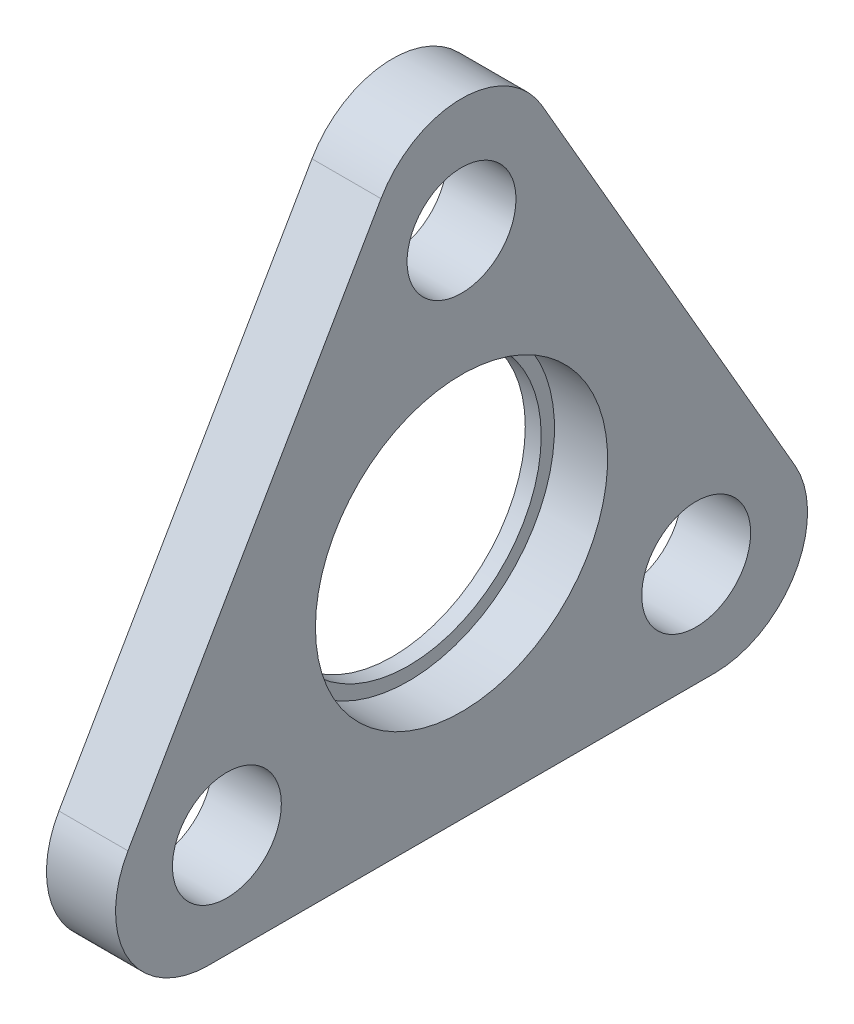
ISO-10303-21;
HEADER;
FILE_DESCRIPTION(('STEP AP214'),'2;1');
FILE_NAME('part.step','',(''),(''),'','','');
FILE_SCHEMA(('AUTOMOTIVE_DESIGN { 1 0 10303 214 1 1 1 1 }'));
ENDSEC;
DATA;
#1=APPLICATION_CONTEXT('core data for automotive mechanical design processes');
#2=APPLICATION_PROTOCOL_DEFINITION('international standard','automotive_design',2000,#1);
#3=PRODUCT_CONTEXT('',#1,'mechanical');
#4=PRODUCT('Part','Part','',(#3));
#5=PRODUCT_RELATED_PRODUCT_CATEGORY('part','',(#4));
#6=PRODUCT_DEFINITION_FORMATION('','',#4);
#7=PRODUCT_DEFINITION_CONTEXT('part definition',#1,'design');
#8=PRODUCT_DEFINITION('design','',#6,#7);
#9=PRODUCT_DEFINITION_SHAPE('','',#8);
#10=(LENGTH_UNIT() NAMED_UNIT(*) SI_UNIT(.MILLI.,.METRE.));
#11=(NAMED_UNIT(*) PLANE_ANGLE_UNIT() SI_UNIT($,.RADIAN.));
#12=(NAMED_UNIT(*) SI_UNIT($,.STERADIAN.) SOLID_ANGLE_UNIT());
#13=UNCERTAINTY_MEASURE_WITH_UNIT(LENGTH_MEASURE(1.E-05),#10,'distance_accuracy_value','');
#14=(GEOMETRIC_REPRESENTATION_CONTEXT(3) GLOBAL_UNCERTAINTY_ASSIGNED_CONTEXT((#13)) GLOBAL_UNIT_ASSIGNED_CONTEXT((#10,
#11,#12)) REPRESENTATION_CONTEXT('',''));
#15=CARTESIAN_POINT('',(0.,0.,0.));
#16=DIRECTION('',(0.,0.,1.));
#17=DIRECTION('',(1.,0.,0.));
#18=AXIS2_PLACEMENT_3D('',#15,#16,#17);
#19=CARTESIAN_POINT('',(0.6,0.,0.));
#20=DIRECTION('',(-1.,0.,0.));
#21=DIRECTION('',(0.,0.,1.));
#22=AXIS2_PLACEMENT_3D('',#19,#20,#21);
#23=CYLINDRICAL_SURFACE('',#22,5.5);
#24=CARTESIAN_POINT('',(0.6,0.,0.));
#25=DIRECTION('',(-1.,0.,0.));
#26=DIRECTION('',(0.,0.,1.));
#27=AXIS2_PLACEMENT_3D('',#24,#25,#26);
#28=CIRCLE('',#27,5.5);
#29=CARTESIAN_POINT('',(0.6,0.,5.5));
#30=VERTEX_POINT('',#29);
#31=EDGE_CURVE('E11',#30,#30,#28,.T.);
#32=ORIENTED_EDGE('',*,*,#31,.T.);
#33=EDGE_LOOP('',(#32));
#34=FACE_BOUND('',#33,.T.);
#35=CARTESIAN_POINT('',(0.,0.,0.));
#36=DIRECTION('',(-1.,0.,0.));
#37=DIRECTION('',(0.,0.,1.));
#38=AXIS2_PLACEMENT_3D('',#35,#36,#37);
#39=CIRCLE('',#38,5.5);
#40=CARTESIAN_POINT('',(0.,0.,5.5));
#41=VERTEX_POINT('',#40);
#42=EDGE_CURVE('E54',#41,#41,#39,.T.);
#43=ORIENTED_EDGE('',*,*,#42,.F.);
#44=EDGE_LOOP('',(#43));
#45=FACE_BOUND('',#44,.T.);
#46=ADVANCED_FACE('F51',(#34,#45),#23,.T.);
#47=CARTESIAN_POINT('',(0.6,0.,0.));
#48=DIRECTION('',(-1.,0.,0.));
#49=DIRECTION('',(0.,0.,1.));
#50=AXIS2_PLACEMENT_3D('',#47,#48,#49);
#51=PLANE('',#50);
#52=CARTESIAN_POINT('',(0.6,0.,0.));
#53=DIRECTION('',(-1.,0.,0.));
#54=DIRECTION('',(0.,0.,1.));
#55=AXIS2_PLACEMENT_3D('',#52,#53,#54);
#56=CIRCLE('',#55,5.);
#57=CARTESIAN_POINT('',(0.6,0.,5.));
#58=VERTEX_POINT('',#57);
#59=EDGE_CURVE('E61',#58,#58,#56,.T.);
#60=ORIENTED_EDGE('',*,*,#59,.T.);
#61=EDGE_LOOP('',(#60));
#62=FACE_BOUND('',#61,.T.);
#63=ORIENTED_EDGE('',*,*,#31,.F.);
#64=EDGE_LOOP('',(#63));
#65=FACE_BOUND('',#64,.T.);
#66=ADVANCED_FACE('F69',(#62,#65),#51,.F.);
#67=CARTESIAN_POINT('',(0.,0.,0.));
#68=DIRECTION('',(-1.,0.,0.));
#69=DIRECTION('',(0.,0.,1.));
#70=AXIS2_PLACEMENT_3D('',#67,#68,#69);
#71=PLANE('',#70);
#72=CARTESIAN_POINT('',(0.,0.,0.));
#73=DIRECTION('',(-1.,0.,0.));
#74=DIRECTION('',(0.,0.,1.));
#75=AXIS2_PLACEMENT_3D('',#72,#73,#74);
#76=CIRCLE('',#75,5.);
#77=CARTESIAN_POINT('',(0.,0.,5.));
#78=VERTEX_POINT('',#77);
#79=EDGE_CURVE('E63',#78,#78,#76,.T.);
#80=ORIENTED_EDGE('',*,*,#79,.F.);
#81=EDGE_LOOP('',(#80));
#82=FACE_BOUND('',#81,.T.);
#83=ORIENTED_EDGE('',*,*,#42,.T.);
#84=EDGE_LOOP('',(#83));
#85=FACE_BOUND('',#84,.T.);
#86=ADVANCED_FACE('F75',(#82,#85),#71,.T.);
#87=CARTESIAN_POINT('',(0.6,0.,0.));
#88=DIRECTION('',(-1.,0.,0.));
#89=DIRECTION('',(0.,0.,1.));
#90=AXIS2_PLACEMENT_3D('',#87,#88,#89);
#91=CYLINDRICAL_SURFACE('',#90,5.);
#92=ORIENTED_EDGE('',*,*,#59,.F.);
#93=EDGE_LOOP('',(#92));
#94=FACE_BOUND('',#93,.T.);
#95=ORIENTED_EDGE('',*,*,#79,.T.);
#96=EDGE_LOOP('',(#95));
#97=FACE_BOUND('',#96,.T.);
#98=ADVANCED_FACE('F72',(#94,#97),#91,.F.);
#99=CLOSED_SHELL('',(#46,#66,#86,#98));
#100=MANIFOLD_SOLID_BREP('B2',#99);
#101=CARTESIAN_POINT('',(2.6,4.49999999999996,7.79422863405993));
#102=DIRECTION('',(0.,-0.499999999999998,-0.86602540378444));
#103=DIRECTION('',(0.,0.86602540378444,-0.499999999999998));
#104=AXIS2_PLACEMENT_3D('',#101,#102,#103);
#105=PLANE('',#104);
#106=DIRECTION('',(0.,-0.86602540378444,0.499999999999998));
#107=VECTOR('',#106,1.);
#108=CARTESIAN_POINT('',(0.,4.49999999999996,7.79422863405993));
#109=LINE('',#108,#107);
#110=CARTESIAN_POINT('',(0.,12.75,3.03108891324554));
#111=VERTEX_POINT('',#110);
#112=CARTESIAN_POINT('',(0.,-3.75000000000009,12.5573683548743));
#113=VERTEX_POINT('',#112);
#114=EDGE_CURVE('E198',#111,#113,#109,.T.);
#115=ORIENTED_EDGE('',*,*,#114,.T.);
#116=DIRECTION('',(-1.,0.,0.));
#117=VECTOR('',#116,1.);
#118=CARTESIAN_POINT('',(2.6,-3.75000000000008,12.5573683548743));
#119=LINE('',#118,#117);
#120=CARTESIAN_POINT('',(2.6,-3.75000000000009,12.5573683548743));
#121=VERTEX_POINT('',#120);
#122=EDGE_CURVE('E173',#113,#121,#119,.F.);
#123=ORIENTED_EDGE('',*,*,#122,.T.);
#124=DIRECTION('',(0.,-0.86602540378444,0.499999999999998));
#125=VECTOR('',#124,1.);
#126=CARTESIAN_POINT('',(2.6,4.49999999999996,7.79422863405993));
#127=LINE('',#126,#125);
#128=CARTESIAN_POINT('',(2.6,12.75,3.03108891324554));
#129=VERTEX_POINT('',#128);
#130=EDGE_CURVE('E219',#129,#121,#127,.T.);
#131=ORIENTED_EDGE('',*,*,#130,.F.);
#132=DIRECTION('',(-1.,0.,0.));
#133=VECTOR('',#132,1.);
#134=CARTESIAN_POINT('',(2.6,12.75,3.03108891324554));
#135=LINE('',#134,#133);
#136=EDGE_CURVE('E179',#129,#111,#135,.T.);
#137=ORIENTED_EDGE('',*,*,#136,.T.);
#138=EDGE_LOOP('',(#115,#123,#131,#137));
#139=FACE_BOUND('',#138,.T.);
#140=ADVANCED_FACE('F113',(#139),#105,.F.);
#141=CARTESIAN_POINT('',(2.6,-9.00000000000008,0.));
#142=DIRECTION('',(0.,1.,0.));
#143=DIRECTION('',(0.,0.,1.));
#144=AXIS2_PLACEMENT_3D('',#141,#142,#143);
#145=PLANE('',#144);
#146=DIRECTION('',(0.,0.,-1.));
#147=VECTOR('',#146,1.);
#148=CARTESIAN_POINT('',(2.6,-9.00000000000008,0.));
#149=LINE('',#148,#147);
#150=CARTESIAN_POINT('',(2.6,-9.00000000000008,9.5262794416288));
#151=VERTEX_POINT('',#150);
#152=CARTESIAN_POINT('',(2.6,-9.00000000000008,-9.5262794416288));
#153=VERTEX_POINT('',#152);
#154=EDGE_CURVE('E188',#151,#153,#149,.T.);
#155=ORIENTED_EDGE('',*,*,#154,.F.);
#156=DIRECTION('',(-1.,0.,0.));
#157=VECTOR('',#156,1.);
#158=CARTESIAN_POINT('',(2.6,-9.00000000000008,9.5262794416288));
#159=LINE('',#158,#157);
#160=CARTESIAN_POINT('',(0.,-9.00000000000008,9.5262794416288));
#161=VERTEX_POINT('',#160);
#162=EDGE_CURVE('E172',#151,#161,#159,.T.);
#163=ORIENTED_EDGE('',*,*,#162,.T.);
#164=DIRECTION('',(0.,0.,-1.));
#165=VECTOR('',#164,1.);
#166=CARTESIAN_POINT('',(0.,-9.00000000000008,0.));
#167=LINE('',#166,#165);
#168=CARTESIAN_POINT('',(0.,-9.00000000000008,-9.5262794416288));
#169=VERTEX_POINT('',#168);
#170=EDGE_CURVE('E186',#161,#169,#167,.T.);
#171=ORIENTED_EDGE('',*,*,#170,.T.);
#172=DIRECTION('',(-1.,0.,0.));
#173=VECTOR('',#172,1.);
#174=CARTESIAN_POINT('',(2.6,-9.00000000000008,-9.5262794416288));
#175=LINE('',#174,#173);
#176=EDGE_CURVE('E191',#169,#153,#175,.F.);
#177=ORIENTED_EDGE('',*,*,#176,.T.);
#178=EDGE_LOOP('',(#155,#163,#171,#177));
#179=FACE_BOUND('',#178,.T.);
#180=ADVANCED_FACE('F185',(#179),#145,.F.);
#181=CARTESIAN_POINT('',(2.6,-5.09999999999962,-8.83345911860193));
#182=DIRECTION('',(-1.,0.,0.));
#183=DIRECTION('',(0.,0.,1.));
#184=AXIS2_PLACEMENT_3D('',#181,#182,#183);
#185=CYLINDRICAL_SURFACE('',#184,2.05);
#186=CARTESIAN_POINT('',(2.6,-5.09999999999962,-8.83345911860193));
#187=DIRECTION('',(1.,0.,0.));
#188=DIRECTION('',(0.,0.,-1.));
#189=AXIS2_PLACEMENT_3D('',#186,#187,#188);
#190=CIRCLE('',#189,2.05);
#191=CARTESIAN_POINT('',(2.6,-5.09999999999962,-10.8834591186019));
#192=VERTEX_POINT('',#191);
#193=EDGE_CURVE('E243',#192,#192,#190,.T.);
#194=ORIENTED_EDGE('',*,*,#193,.T.);
#195=EDGE_LOOP('',(#194));
#196=FACE_BOUND('',#195,.T.);
#197=CARTESIAN_POINT('',(0.,-5.09999999999962,-8.83345911860193));
#198=DIRECTION('',(1.,0.,0.));
#199=DIRECTION('',(0.,0.,-1.));
#200=AXIS2_PLACEMENT_3D('',#197,#198,#199);
#201=CIRCLE('',#200,2.05);
#202=CARTESIAN_POINT('',(0.,-5.09999999999962,-10.8834591186019));
#203=VERTEX_POINT('',#202);
#204=EDGE_CURVE('E211',#203,#203,#201,.T.);
#205=ORIENTED_EDGE('',*,*,#204,.F.);
#206=EDGE_LOOP('',(#205));
#207=FACE_BOUND('',#206,.T.);
#208=ADVANCED_FACE('F293',(#196,#207),#185,.F.);
#209=CARTESIAN_POINT('',(2.6,-5.10000000000038,8.83345911860062));
#210=DIRECTION('',(-1.,0.,0.));
#211=DIRECTION('',(0.,0.,1.));
#212=AXIS2_PLACEMENT_3D('',#209,#210,#211);
#213=CYLINDRICAL_SURFACE('',#212,2.05);
#214=CARTESIAN_POINT('',(2.6,-5.10000000000038,8.83345911860062));
#215=DIRECTION('',(1.,0.,0.));
#216=DIRECTION('',(0.,0.,-1.));
#217=AXIS2_PLACEMENT_3D('',#214,#215,#216);
#218=CIRCLE('',#217,2.05);
#219=CARTESIAN_POINT('',(2.6,-5.10000000000038,6.78345911860062));
#220=VERTEX_POINT('',#219);
#221=EDGE_CURVE('E246',#220,#220,#218,.T.);
#222=ORIENTED_EDGE('',*,*,#221,.T.);
#223=EDGE_LOOP('',(#222));
#224=FACE_BOUND('',#223,.T.);
#225=CARTESIAN_POINT('',(0.,-5.10000000000038,8.83345911860062));
#226=DIRECTION('',(1.,0.,0.));
#227=DIRECTION('',(0.,0.,-1.));
#228=AXIS2_PLACEMENT_3D('',#225,#226,#227);
#229=CIRCLE('',#228,2.05);
#230=CARTESIAN_POINT('',(0.,-5.10000000000038,6.78345911860062));
#231=VERTEX_POINT('',#230);
#232=EDGE_CURVE('E202',#231,#231,#229,.T.);
#233=ORIENTED_EDGE('',*,*,#232,.F.);
#234=EDGE_LOOP('',(#233));
#235=FACE_BOUND('',#234,.T.);
#236=ADVANCED_FACE('F320',(#224,#235),#213,.F.);
#237=CARTESIAN_POINT('',(2.6,4.49999999999996,-7.79422863405993));
#238=DIRECTION('',(0.,-0.499999999999998,0.86602540378444));
#239=DIRECTION('',(0.,-0.86602540378444,-0.499999999999998));
#240=AXIS2_PLACEMENT_3D('',#237,#238,#239);
#241=PLANE('',#240);
#242=DIRECTION('',(0.,0.86602540378444,0.499999999999998));
#243=VECTOR('',#242,1.);
#244=CARTESIAN_POINT('',(2.6,4.49999999999996,-7.79422863405993));
#245=LINE('',#244,#243);
#246=CARTESIAN_POINT('',(2.6,-3.75000000000008,-12.5573683548743));
#247=VERTEX_POINT('',#246);
#248=CARTESIAN_POINT('',(2.6,12.75,-3.03108891324554));
#249=VERTEX_POINT('',#248);
#250=EDGE_CURVE('E250',#247,#249,#245,.T.);
#251=ORIENTED_EDGE('',*,*,#250,.F.);
#252=DIRECTION('',(-1.,0.,0.));
#253=VECTOR('',#252,1.);
#254=CARTESIAN_POINT('',(2.6,-3.75000000000008,-12.5573683548743));
#255=LINE('',#254,#253);
#256=CARTESIAN_POINT('',(0.,-3.75000000000008,-12.5573683548743));
#257=VERTEX_POINT('',#256);
#258=EDGE_CURVE('E49',#247,#257,#255,.T.);
#259=ORIENTED_EDGE('',*,*,#258,.T.);
#260=DIRECTION('',(0.,0.86602540378444,0.499999999999998));
#261=VECTOR('',#260,1.);
#262=CARTESIAN_POINT('',(0.,4.49999999999996,-7.79422863405993));
#263=LINE('',#262,#261);
#264=CARTESIAN_POINT('',(0.,12.75,-3.03108891324554));
#265=VERTEX_POINT('',#264);
#266=EDGE_CURVE('E197',#257,#265,#263,.T.);
#267=ORIENTED_EDGE('',*,*,#266,.T.);
#268=DIRECTION('',(-1.,0.,0.));
#269=VECTOR('',#268,1.);
#270=CARTESIAN_POINT('',(2.6,12.75,-3.03108891324554));
#271=LINE('',#270,#269);
#272=EDGE_CURVE('E122',#265,#249,#271,.F.);
#273=ORIENTED_EDGE('',*,*,#272,.T.);
#274=EDGE_LOOP('',(#251,#259,#267,#273));
#275=FACE_BOUND('',#274,.T.);
#276=ADVANCED_FACE('F303',(#275),#241,.F.);
#277=CARTESIAN_POINT('',(2.6,10.2,0.));
#278=DIRECTION('',(-1.,0.,0.));
#279=DIRECTION('',(0.,0.,1.));
#280=AXIS2_PLACEMENT_3D('',#277,#278,#279);
#281=CYLINDRICAL_SURFACE('',#280,2.05);
#282=CARTESIAN_POINT('',(2.6,10.2,0.));
#283=DIRECTION('',(1.,0.,0.));
#284=DIRECTION('',(0.,0.,-1.));
#285=AXIS2_PLACEMENT_3D('',#282,#283,#284);
#286=CIRCLE('',#285,2.05);
#287=CARTESIAN_POINT('',(2.6,10.2,-2.05));
#288=VERTEX_POINT('',#287);
#289=EDGE_CURVE('E221',#288,#288,#286,.T.);
#290=ORIENTED_EDGE('',*,*,#289,.T.);
#291=EDGE_LOOP('',(#290));
#292=FACE_BOUND('',#291,.T.);
#293=CARTESIAN_POINT('',(0.,10.2,0.));
#294=DIRECTION('',(1.,0.,0.));
#295=DIRECTION('',(0.,0.,-1.));
#296=AXIS2_PLACEMENT_3D('',#293,#294,#295);
#297=CIRCLE('',#296,2.05);
#298=CARTESIAN_POINT('',(0.,10.2,-2.05));
#299=VERTEX_POINT('',#298);
#300=EDGE_CURVE('E215',#299,#299,#297,.T.);
#301=ORIENTED_EDGE('',*,*,#300,.F.);
#302=EDGE_LOOP('',(#301));
#303=FACE_BOUND('',#302,.T.);
#304=ADVANCED_FACE('F284',(#292,#303),#281,.F.);
#305=CARTESIAN_POINT('',(2.6,0.,0.));
#306=DIRECTION('',(1.,0.,0.));
#307=DIRECTION('',(0.,0.,-1.));
#308=AXIS2_PLACEMENT_3D('',#305,#306,#307);
#309=PLANE('',#308);
#310=CARTESIAN_POINT('',(2.6,0.,0.));
#311=DIRECTION('',(-1.,0.,0.));
#312=DIRECTION('',(0.,0.,1.));
#313=AXIS2_PLACEMENT_3D('',#310,#311,#312);
#314=CIRCLE('',#313,5.5);
#315=CARTESIAN_POINT('',(2.6,0.,5.5));
#316=VERTEX_POINT('',#315);
#317=EDGE_CURVE('E204',#316,#316,#314,.T.);
#318=ORIENTED_EDGE('',*,*,#317,.T.);
#319=EDGE_LOOP('',(#318));
#320=FACE_BOUND('',#319,.T.);
#321=ORIENTED_EDGE('',*,*,#130,.T.);
#322=CARTESIAN_POINT('',(2.6,-5.50000000000008,9.5262794416288));
#323=DIRECTION('',(1.,0.,0.));
#324=DIRECTION('',(0.,0.,-1.));
#325=AXIS2_PLACEMENT_3D('',#322,#323,#324);
#326=CIRCLE('',#325,3.5);
#327=EDGE_CURVE('E237',#121,#151,#326,.T.);
#328=ORIENTED_EDGE('',*,*,#327,.T.);
#329=ORIENTED_EDGE('',*,*,#154,.T.);
#330=CARTESIAN_POINT('',(2.6,-5.50000000000008,-9.5262794416288));
#331=DIRECTION('',(1.,0.,0.));
#332=DIRECTION('',(0.,0.,-1.));
#333=AXIS2_PLACEMENT_3D('',#330,#331,#332);
#334=CIRCLE('',#333,3.5);
#335=EDGE_CURVE('E135',#153,#247,#334,.T.);
#336=ORIENTED_EDGE('',*,*,#335,.T.);
#337=ORIENTED_EDGE('',*,*,#250,.T.);
#338=CARTESIAN_POINT('',(2.6,11.,0.));
#339=DIRECTION('',(1.,0.,0.));
#340=DIRECTION('',(0.,0.,-1.));
#341=AXIS2_PLACEMENT_3D('',#338,#339,#340);
#342=CIRCLE('',#341,3.5);
#343=EDGE_CURVE('E232',#249,#129,#342,.T.);
#344=ORIENTED_EDGE('',*,*,#343,.T.);
#345=EDGE_LOOP('',(#321,#328,#329,#336,#337,#344));
#346=FACE_BOUND('',#345,.T.);
#347=ORIENTED_EDGE('',*,*,#221,.F.);
#348=EDGE_LOOP('',(#347));
#349=FACE_BOUND('',#348,.T.);
#350=ORIENTED_EDGE('',*,*,#193,.F.);
#351=EDGE_LOOP('',(#350));
#352=FACE_BOUND('',#351,.T.);
#353=ORIENTED_EDGE('',*,*,#289,.F.);
#354=EDGE_LOOP('',(#353));
#355=FACE_BOUND('',#354,.T.);
#356=ADVANCED_FACE('F268',(#320,#346,#349,#352,#355),#309,.T.);
#357=CARTESIAN_POINT('',(0.,0.,0.));
#358=DIRECTION('',(1.,0.,0.));
#359=DIRECTION('',(0.,0.,-1.));
#360=AXIS2_PLACEMENT_3D('',#357,#358,#359);
#361=PLANE('',#360);
#362=CARTESIAN_POINT('',(0.,0.,0.));
#363=DIRECTION('',(-1.,0.,0.));
#364=DIRECTION('',(0.,0.,1.));
#365=AXIS2_PLACEMENT_3D('',#362,#363,#364);
#366=CIRCLE('',#365,5.5);
#367=CARTESIAN_POINT('',(0.,0.,5.5));
#368=VERTEX_POINT('',#367);
#369=EDGE_CURVE('E260',#368,#368,#366,.T.);
#370=ORIENTED_EDGE('',*,*,#369,.F.);
#371=EDGE_LOOP('',(#370));
#372=FACE_BOUND('',#371,.T.);
#373=ORIENTED_EDGE('',*,*,#170,.F.);
#374=CARTESIAN_POINT('',(0.,-5.50000000000008,9.5262794416288));
#375=DIRECTION('',(1.,0.,0.));
#376=DIRECTION('',(0.,0.,-1.));
#377=AXIS2_PLACEMENT_3D('',#374,#375,#376);
#378=CIRCLE('',#377,3.5);
#379=EDGE_CURVE('E168',#161,#113,#378,.F.);
#380=ORIENTED_EDGE('',*,*,#379,.T.);
#381=ORIENTED_EDGE('',*,*,#114,.F.);
#382=CARTESIAN_POINT('',(0.,11.,0.));
#383=DIRECTION('',(1.,0.,0.));
#384=DIRECTION('',(0.,0.,-1.));
#385=AXIS2_PLACEMENT_3D('',#382,#383,#384);
#386=CIRCLE('',#385,3.5);
#387=EDGE_CURVE('E190',#111,#265,#386,.F.);
#388=ORIENTED_EDGE('',*,*,#387,.T.);
#389=ORIENTED_EDGE('',*,*,#266,.F.);
#390=CARTESIAN_POINT('',(0.,-5.50000000000008,-9.5262794416288));
#391=DIRECTION('',(1.,0.,0.));
#392=DIRECTION('',(0.,0.,-1.));
#393=AXIS2_PLACEMENT_3D('',#390,#391,#392);
#394=CIRCLE('',#393,3.5);
#395=EDGE_CURVE('E180',#257,#169,#394,.F.);
#396=ORIENTED_EDGE('',*,*,#395,.T.);
#397=EDGE_LOOP('',(#373,#380,#381,#388,#389,#396));
#398=FACE_BOUND('',#397,.T.);
#399=ORIENTED_EDGE('',*,*,#232,.T.);
#400=EDGE_LOOP('',(#399));
#401=FACE_BOUND('',#400,.T.);
#402=ORIENTED_EDGE('',*,*,#204,.T.);
#403=EDGE_LOOP('',(#402));
#404=FACE_BOUND('',#403,.T.);
#405=ORIENTED_EDGE('',*,*,#300,.T.);
#406=EDGE_LOOP('',(#405));
#407=FACE_BOUND('',#406,.T.);
#408=ADVANCED_FACE('F193',(#372,#398,#401,#404,#407),#361,.F.);
#409=CARTESIAN_POINT('',(2.6,-5.50000000000008,9.5262794416288));
#410=DIRECTION('',(-1.,0.,0.));
#411=DIRECTION('',(0.,0.,1.));
#412=AXIS2_PLACEMENT_3D('',#409,#410,#411);
#413=CYLINDRICAL_SURFACE('',#412,3.5);
#414=ORIENTED_EDGE('',*,*,#327,.F.);
#415=ORIENTED_EDGE('',*,*,#122,.F.);
#416=ORIENTED_EDGE('',*,*,#379,.F.);
#417=ORIENTED_EDGE('',*,*,#162,.F.);
#418=EDGE_LOOP('',(#414,#415,#416,#417));
#419=FACE_BOUND('',#418,.T.);
#420=ADVANCED_FACE('F171',(#419),#413,.T.);
#421=CARTESIAN_POINT('',(2.6,-5.50000000000008,-9.5262794416288));
#422=DIRECTION('',(-1.,0.,0.));
#423=DIRECTION('',(0.,0.,1.));
#424=AXIS2_PLACEMENT_3D('',#421,#422,#423);
#425=CYLINDRICAL_SURFACE('',#424,3.5);
#426=ORIENTED_EDGE('',*,*,#335,.F.);
#427=ORIENTED_EDGE('',*,*,#176,.F.);
#428=ORIENTED_EDGE('',*,*,#395,.F.);
#429=ORIENTED_EDGE('',*,*,#258,.F.);
#430=EDGE_LOOP('',(#426,#427,#428,#429));
#431=FACE_BOUND('',#430,.T.);
#432=ADVANCED_FACE('F282',(#431),#425,.T.);
#433=CARTESIAN_POINT('',(2.6,11.,0.));
#434=DIRECTION('',(-1.,0.,0.));
#435=DIRECTION('',(0.,0.,1.));
#436=AXIS2_PLACEMENT_3D('',#433,#434,#435);
#437=CYLINDRICAL_SURFACE('',#436,3.5);
#438=ORIENTED_EDGE('',*,*,#343,.F.);
#439=ORIENTED_EDGE('',*,*,#272,.F.);
#440=ORIENTED_EDGE('',*,*,#387,.F.);
#441=ORIENTED_EDGE('',*,*,#136,.F.);
#442=EDGE_LOOP('',(#438,#439,#440,#441));
#443=FACE_BOUND('',#442,.T.);
#444=ADVANCED_FACE('F115',(#443),#437,.T.);
#445=CARTESIAN_POINT('',(2.6,0.,0.));
#446=DIRECTION('',(-1.,0.,0.));
#447=DIRECTION('',(0.,0.,1.));
#448=AXIS2_PLACEMENT_3D('',#445,#446,#447);
#449=CYLINDRICAL_SURFACE('',#448,5.5);
#450=ORIENTED_EDGE('',*,*,#317,.F.);
#451=EDGE_LOOP('',(#450));
#452=FACE_BOUND('',#451,.T.);
#453=ORIENTED_EDGE('',*,*,#369,.T.);
#454=EDGE_LOOP('',(#453));
#455=FACE_BOUND('',#454,.T.);
#456=ADVANCED_FACE('F270',(#452,#455),#449,.F.);
#457=CLOSED_SHELL('',(#140,#180,#208,#236,#276,#304,#356,#408,#420,#432,#444,#456));
#458=MANIFOLD_SOLID_BREP('B6',#457);
#459=ADVANCED_BREP_SHAPE_REPRESENTATION('',(#18,#100,#458),#14);
#460=SHAPE_DEFINITION_REPRESENTATION(#9,#459);
ENDSEC;
END-ISO-10303-21;
